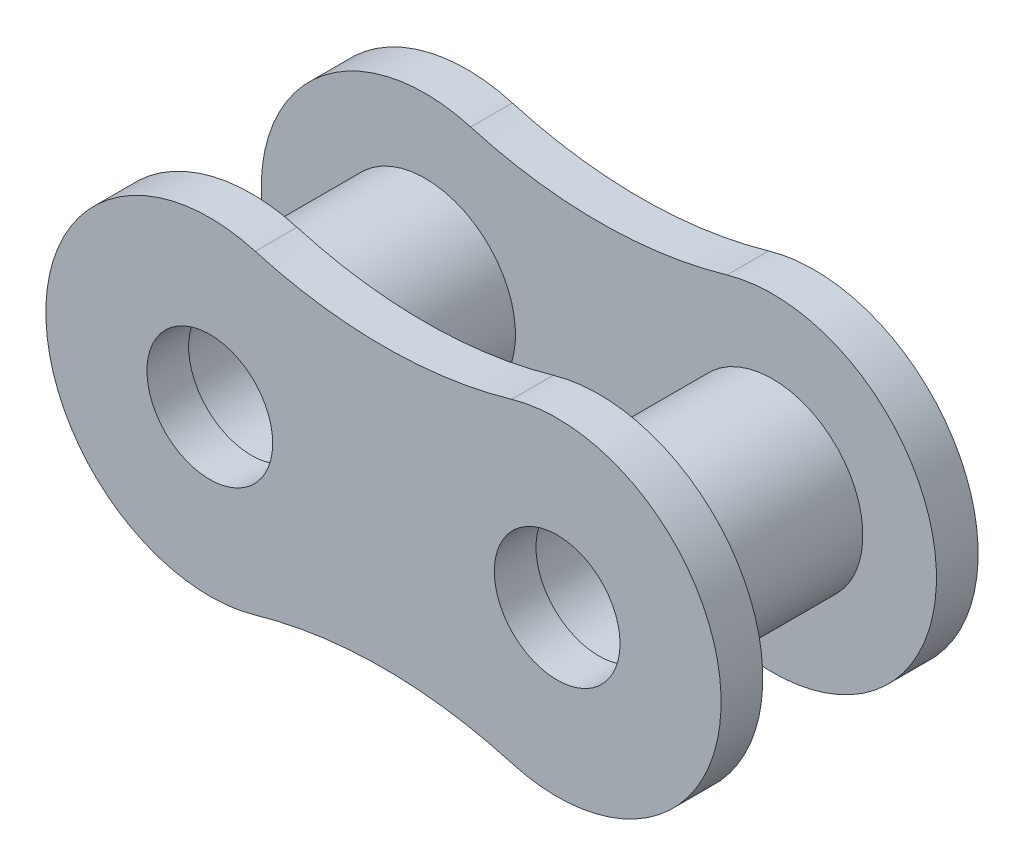
ISO-10303-21;
HEADER;
FILE_DESCRIPTION(('STEP AP214'),'2;1');
FILE_NAME('part.step','',(''),(''),'','','');
FILE_SCHEMA(('AUTOMOTIVE_DESIGN { 1 0 10303 214 1 1 1 1 }'));
ENDSEC;
DATA;
#1=APPLICATION_CONTEXT('core data for automotive mechanical design processes');
#2=APPLICATION_PROTOCOL_DEFINITION('international standard','automotive_design',2000,#1);
#3=PRODUCT_CONTEXT('',#1,'mechanical');
#4=PRODUCT('Part','Part','',(#3));
#5=PRODUCT_RELATED_PRODUCT_CATEGORY('part','',(#4));
#6=PRODUCT_DEFINITION_FORMATION('','',#4);
#7=PRODUCT_DEFINITION_CONTEXT('part definition',#1,'design');
#8=PRODUCT_DEFINITION('design','',#6,#7);
#9=PRODUCT_DEFINITION_SHAPE('','',#8);
#10=(LENGTH_UNIT() NAMED_UNIT(*) SI_UNIT(.MILLI.,.METRE.));
#11=(NAMED_UNIT(*) PLANE_ANGLE_UNIT() SI_UNIT($,.RADIAN.));
#12=(NAMED_UNIT(*) SI_UNIT($,.STERADIAN.) SOLID_ANGLE_UNIT());
#13=UNCERTAINTY_MEASURE_WITH_UNIT(LENGTH_MEASURE(1.E-05),#10,'distance_accuracy_value','');
#14=(GEOMETRIC_REPRESENTATION_CONTEXT(3) GLOBAL_UNCERTAINTY_ASSIGNED_CONTEXT((#13)) GLOBAL_UNIT_ASSIGNED_CONTEXT((#10,
#11,#12)) REPRESENTATION_CONTEXT('',''));
#15=CARTESIAN_POINT('',(0.,0.,0.));
#16=DIRECTION('',(0.,0.,1.));
#17=DIRECTION('',(1.,0.,0.));
#18=AXIS2_PLACEMENT_3D('',#15,#16,#17);
#19=CARTESIAN_POINT('',(1.5875,5.4931840960452,-1.5875));
#20=DIRECTION('',(0.,0.,-1.));
#21=DIRECTION('',(1.,0.,0.));
#22=AXIS2_PLACEMENT_3D('',#19,#20,#21);
#23=PLANE('',#22);
#24=CARTESIAN_POINT('',(0.,10.9863681920904,-1.5875));
#25=DIRECTION('',(0.,0.,-1.));
#26=DIRECTION('',(1.,0.,0.));
#27=AXIS2_PLACEMENT_3D('',#24,#25,#26);
#28=CIRCLE('',#27,8.4387481920904);
#29=CARTESIAN_POINT('',(2.34287748246518,2.87937145151707,-1.5875));
#30=VERTEX_POINT('',#29);
#31=CARTESIAN_POINT('',(-2.34287748246518,2.87937145151707,-1.5875));
#32=VERTEX_POINT('',#31);
#33=EDGE_CURVE('E157',#30,#32,#28,.T.);
#34=ORIENTED_EDGE('',*,*,#33,.T.);
#35=CARTESIAN_POINT('',(-3.175,0.,-1.5875));
#36=DIRECTION('',(0.,0.,1.));
#37=DIRECTION('',(1.,0.,0.));
#38=AXIS2_PLACEMENT_3D('',#35,#36,#37);
#39=CIRCLE('',#38,2.9972);
#40=CARTESIAN_POINT('',(-2.34287748246518,-2.87937145151707,-1.5875));
#41=VERTEX_POINT('',#40);
#42=EDGE_CURVE('E171',#32,#41,#39,.T.);
#43=ORIENTED_EDGE('',*,*,#42,.T.);
#44=CARTESIAN_POINT('',(0.,-10.9863681920904,-1.5875));
#45=DIRECTION('',(0.,0.,-1.));
#46=DIRECTION('',(1.,0.,0.));
#47=AXIS2_PLACEMENT_3D('',#44,#45,#46);
#48=CIRCLE('',#47,8.4387481920904);
#49=CARTESIAN_POINT('',(2.34287748246518,-2.87937145151707,-1.5875));
#50=VERTEX_POINT('',#49);
#51=EDGE_CURVE('E174',#41,#50,#48,.T.);
#52=ORIENTED_EDGE('',*,*,#51,.T.);
#53=CARTESIAN_POINT('',(3.175,0.,-1.5875));
#54=DIRECTION('',(0.,0.,1.));
#55=DIRECTION('',(1.,0.,0.));
#56=AXIS2_PLACEMENT_3D('',#53,#54,#55);
#57=CIRCLE('',#56,2.9972);
#58=EDGE_CURVE('E163',#50,#30,#57,.T.);
#59=ORIENTED_EDGE('',*,*,#58,.T.);
#60=EDGE_LOOP('',(#34,#43,#52,#59));
#61=FACE_BOUND('',#60,.T.);
#62=CARTESIAN_POINT('',(-3.175,0.,-1.5875));
#63=DIRECTION('',(0.,0.,-1.));
#64=DIRECTION('',(-1.,0.,0.));
#65=AXIS2_PLACEMENT_3D('',#62,#63,#64);
#66=CIRCLE('',#65,1.651);
#67=CARTESIAN_POINT('',(-4.826,0.,-1.5875));
#68=VERTEX_POINT('',#67);
#69=EDGE_CURVE('E45',#68,#68,#66,.F.);
#70=ORIENTED_EDGE('',*,*,#69,.F.);
#71=EDGE_LOOP('',(#70));
#72=FACE_BOUND('',#71,.T.);
#73=CARTESIAN_POINT('',(3.175,0.,-1.5875));
#74=DIRECTION('',(0.,0.,-1.));
#75=DIRECTION('',(-1.,0.,0.));
#76=AXIS2_PLACEMENT_3D('',#73,#74,#75);
#77=CIRCLE('',#76,1.651);
#78=CARTESIAN_POINT('',(1.524,0.,-1.5875));
#79=VERTEX_POINT('',#78);
#80=EDGE_CURVE('E11',#79,#79,#77,.F.);
#81=ORIENTED_EDGE('',*,*,#80,.F.);
#82=EDGE_LOOP('',(#81));
#83=FACE_BOUND('',#82,.T.);
#84=ADVANCED_FACE('F36',(#61,#72,#83),#23,.F.);
#85=CARTESIAN_POINT('',(3.175,0.,-1.5875));
#86=DIRECTION('',(0.,0.,1.));
#87=DIRECTION('',(1.,0.,0.));
#88=AXIS2_PLACEMENT_3D('',#85,#86,#87);
#89=CIRCLE('',#88,1.17475);
#90=CARTESIAN_POINT('',(4.34975,0.,-1.5875));
#91=VERTEX_POINT('',#90);
#92=EDGE_CURVE('E275',#91,#91,#89,.T.);
#93=ORIENTED_EDGE('',*,*,#92,.T.);
#94=EDGE_LOOP('',(#93));
#95=FACE_BOUND('',#94,.T.);
#96=CARTESIAN_POINT('',(3.175,0.,-1.5875));
#97=DIRECTION('',(0.,0.,1.));
#98=DIRECTION('',(1.,0.,0.));
#99=AXIS2_PLACEMENT_3D('',#96,#97,#98);
#100=CIRCLE('',#99,1.14935);
#101=CARTESIAN_POINT('',(4.32435,0.,-1.5875));
#102=VERTEX_POINT('',#101);
#103=EDGE_CURVE('E147',#102,#102,#100,.T.);
#104=ORIENTED_EDGE('',*,*,#103,.F.);
#105=EDGE_LOOP('',(#104));
#106=FACE_BOUND('',#105,.T.);
#107=ADVANCED_FACE('F189',(#95,#106),#23,.F.);
#108=CARTESIAN_POINT('',(1.5875,5.4931840960452,-2.3495));
#109=DIRECTION('',(0.,0.,-1.));
#110=DIRECTION('',(1.,0.,0.));
#111=AXIS2_PLACEMENT_3D('',#108,#109,#110);
#112=PLANE('',#111);
#113=CARTESIAN_POINT('',(-3.175,0.,-2.3495));
#114=DIRECTION('',(0.,0.,1.));
#115=DIRECTION('',(1.,0.,0.));
#116=AXIS2_PLACEMENT_3D('',#113,#114,#115);
#117=CIRCLE('',#116,1.14935);
#118=CARTESIAN_POINT('',(-2.02565,0.,-2.3495));
#119=VERTEX_POINT('',#118);
#120=EDGE_CURVE('E154',#119,#119,#117,.T.);
#121=ORIENTED_EDGE('',*,*,#120,.T.);
#122=EDGE_LOOP('',(#121));
#123=FACE_BOUND('',#122,.T.);
#124=CARTESIAN_POINT('',(0.,10.9863681920904,-2.3495));
#125=DIRECTION('',(0.,0.,-1.));
#126=DIRECTION('',(1.,0.,0.));
#127=AXIS2_PLACEMENT_3D('',#124,#125,#126);
#128=CIRCLE('',#127,8.4387481920904);
#129=CARTESIAN_POINT('',(2.34287748246518,2.87937145151707,-2.3495));
#130=VERTEX_POINT('',#129);
#131=CARTESIAN_POINT('',(-2.34287748246518,2.87937145151707,-2.3495));
#132=VERTEX_POINT('',#131);
#133=EDGE_CURVE('E160',#130,#132,#128,.T.);
#134=ORIENTED_EDGE('',*,*,#133,.F.);
#135=CARTESIAN_POINT('',(3.175,0.,-2.3495));
#136=DIRECTION('',(0.,0.,1.));
#137=DIRECTION('',(1.,0.,0.));
#138=AXIS2_PLACEMENT_3D('',#135,#136,#137);
#139=CIRCLE('',#138,2.9972);
#140=CARTESIAN_POINT('',(2.34287748246518,-2.87937145151707,-2.3495));
#141=VERTEX_POINT('',#140);
#142=EDGE_CURVE('E167',#141,#130,#139,.T.);
#143=ORIENTED_EDGE('',*,*,#142,.F.);
#144=CARTESIAN_POINT('',(0.,-10.9863681920904,-2.3495));
#145=DIRECTION('',(0.,0.,-1.));
#146=DIRECTION('',(1.,0.,0.));
#147=AXIS2_PLACEMENT_3D('',#144,#145,#146);
#148=CIRCLE('',#147,8.4387481920904);
#149=CARTESIAN_POINT('',(-2.34287748246518,-2.87937145151707,-2.3495));
#150=VERTEX_POINT('',#149);
#151=EDGE_CURVE('E165',#150,#141,#148,.T.);
#152=ORIENTED_EDGE('',*,*,#151,.F.);
#153=CARTESIAN_POINT('',(-3.175,0.,-2.3495));
#154=DIRECTION('',(0.,0.,1.));
#155=DIRECTION('',(1.,0.,0.));
#156=AXIS2_PLACEMENT_3D('',#153,#154,#155);
#157=CIRCLE('',#156,2.9972);
#158=EDGE_CURVE('E162',#132,#150,#157,.T.);
#159=ORIENTED_EDGE('',*,*,#158,.F.);
#160=EDGE_LOOP('',(#134,#143,#152,#159));
#161=FACE_BOUND('',#160,.T.);
#162=CARTESIAN_POINT('',(3.175,0.,-2.3495));
#163=DIRECTION('',(0.,0.,1.));
#164=DIRECTION('',(1.,0.,0.));
#165=AXIS2_PLACEMENT_3D('',#162,#163,#164);
#166=CIRCLE('',#165,1.14935);
#167=CARTESIAN_POINT('',(4.32435,0.,-2.3495));
#168=VERTEX_POINT('',#167);
#169=EDGE_CURVE('E148',#168,#168,#166,.T.);
#170=ORIENTED_EDGE('',*,*,#169,.T.);
#171=EDGE_LOOP('',(#170));
#172=FACE_BOUND('',#171,.T.);
#173=ADVANCED_FACE('F245',(#123,#161,#172),#112,.T.);
#174=CARTESIAN_POINT('',(-3.175,0.,-1.5875));
#175=DIRECTION('',(0.,0.,1.));
#176=DIRECTION('',(1.,0.,0.));
#177=AXIS2_PLACEMENT_3D('',#174,#175,#176);
#178=CIRCLE('',#177,1.17475);
#179=CARTESIAN_POINT('',(-2.00025,0.,-1.5875));
#180=VERTEX_POINT('',#179);
#181=EDGE_CURVE('E284',#180,#180,#178,.T.);
#182=ORIENTED_EDGE('',*,*,#181,.T.);
#183=EDGE_LOOP('',(#182));
#184=FACE_BOUND('',#183,.T.);
#185=CARTESIAN_POINT('',(-3.175,0.,-1.5875));
#186=DIRECTION('',(0.,0.,1.));
#187=DIRECTION('',(1.,0.,0.));
#188=AXIS2_PLACEMENT_3D('',#185,#186,#187);
#189=CIRCLE('',#188,1.14935);
#190=CARTESIAN_POINT('',(-2.02565,0.,-1.5875));
#191=VERTEX_POINT('',#190);
#192=EDGE_CURVE('E151',#191,#191,#189,.T.);
#193=ORIENTED_EDGE('',*,*,#192,.F.);
#194=EDGE_LOOP('',(#193));
#195=FACE_BOUND('',#194,.T.);
#196=ADVANCED_FACE('F192',(#184,#195),#23,.F.);
#197=CARTESIAN_POINT('',(0.,10.9863681920904,-2.3495));
#198=DIRECTION('',(0.,0.,1.));
#199=DIRECTION('',(-1.,0.,0.));
#200=AXIS2_PLACEMENT_3D('',#197,#198,#199);
#201=CYLINDRICAL_SURFACE('',#200,8.4387481920904);
#202=ORIENTED_EDGE('',*,*,#33,.F.);
#203=DIRECTION('',(0.,0.,1.));
#204=VECTOR('',#203,1.);
#205=CARTESIAN_POINT('',(2.34287748246518,2.87937145151707,-2.3495));
#206=LINE('',#205,#204);
#207=EDGE_CURVE('E53',#130,#30,#206,.T.);
#208=ORIENTED_EDGE('',*,*,#207,.F.);
#209=ORIENTED_EDGE('',*,*,#133,.T.);
#210=DIRECTION('',(0.,0.,1.));
#211=VECTOR('',#210,1.);
#212=CARTESIAN_POINT('',(-2.34287748246518,2.87937145151707,-2.3495));
#213=LINE('',#212,#211);
#214=EDGE_CURVE('E81',#132,#32,#213,.T.);
#215=ORIENTED_EDGE('',*,*,#214,.T.);
#216=EDGE_LOOP('',(#202,#208,#209,#215));
#217=FACE_BOUND('',#216,.T.);
#218=ADVANCED_FACE('F38',(#217),#201,.F.);
#219=CARTESIAN_POINT('',(-3.175,0.,-2.3495));
#220=DIRECTION('',(0.,0.,1.));
#221=DIRECTION('',(-1.,0.,0.));
#222=AXIS2_PLACEMENT_3D('',#219,#220,#221);
#223=CYLINDRICAL_SURFACE('',#222,2.9972);
#224=ORIENTED_EDGE('',*,*,#42,.F.);
#225=ORIENTED_EDGE('',*,*,#214,.F.);
#226=ORIENTED_EDGE('',*,*,#158,.T.);
#227=DIRECTION('',(0.,0.,1.));
#228=VECTOR('',#227,1.);
#229=CARTESIAN_POINT('',(-2.34287748246518,-2.87937145151707,-2.3495));
#230=LINE('',#229,#228);
#231=EDGE_CURVE('E180',#150,#41,#230,.T.);
#232=ORIENTED_EDGE('',*,*,#231,.T.);
#233=EDGE_LOOP('',(#224,#225,#226,#232));
#234=FACE_BOUND('',#233,.T.);
#235=ADVANCED_FACE('F255',(#234),#223,.T.);
#236=CARTESIAN_POINT('',(0.,-10.9863681920904,-2.3495));
#237=DIRECTION('',(0.,0.,1.));
#238=DIRECTION('',(-1.,0.,0.));
#239=AXIS2_PLACEMENT_3D('',#236,#237,#238);
#240=CYLINDRICAL_SURFACE('',#239,8.4387481920904);
#241=ORIENTED_EDGE('',*,*,#51,.F.);
#242=ORIENTED_EDGE('',*,*,#231,.F.);
#243=ORIENTED_EDGE('',*,*,#151,.T.);
#244=DIRECTION('',(0.,0.,1.));
#245=VECTOR('',#244,1.);
#246=CARTESIAN_POINT('',(2.34287748246518,-2.87937145151707,-2.3495));
#247=LINE('',#246,#245);
#248=EDGE_CURVE('E71',#141,#50,#247,.T.);
#249=ORIENTED_EDGE('',*,*,#248,.T.);
#250=EDGE_LOOP('',(#241,#242,#243,#249));
#251=FACE_BOUND('',#250,.T.);
#252=ADVANCED_FACE('F253',(#251),#240,.F.);
#253=CARTESIAN_POINT('',(3.175,0.,-2.3495));
#254=DIRECTION('',(0.,0.,1.));
#255=DIRECTION('',(-1.,0.,0.));
#256=AXIS2_PLACEMENT_3D('',#253,#254,#255);
#257=CYLINDRICAL_SURFACE('',#256,2.9972);
#258=ORIENTED_EDGE('',*,*,#58,.F.);
#259=ORIENTED_EDGE('',*,*,#248,.F.);
#260=ORIENTED_EDGE('',*,*,#142,.T.);
#261=ORIENTED_EDGE('',*,*,#207,.T.);
#262=EDGE_LOOP('',(#258,#259,#260,#261));
#263=FACE_BOUND('',#262,.T.);
#264=ADVANCED_FACE('F243',(#263),#257,.T.);
#265=CARTESIAN_POINT('',(-3.175,0.,-2.3495));
#266=DIRECTION('',(0.,0.,1.));
#267=DIRECTION('',(-1.,0.,0.));
#268=AXIS2_PLACEMENT_3D('',#265,#266,#267);
#269=CYLINDRICAL_SURFACE('',#268,1.14935);
#270=ORIENTED_EDGE('',*,*,#120,.F.);
#271=EDGE_LOOP('',(#270));
#272=FACE_BOUND('',#271,.T.);
#273=ORIENTED_EDGE('',*,*,#192,.T.);
#274=EDGE_LOOP('',(#273));
#275=FACE_BOUND('',#274,.T.);
#276=ADVANCED_FACE('F239',(#272,#275),#269,.F.);
#277=CARTESIAN_POINT('',(3.175,0.,-2.3495));
#278=DIRECTION('',(0.,0.,1.));
#279=DIRECTION('',(-1.,0.,0.));
#280=AXIS2_PLACEMENT_3D('',#277,#278,#279);
#281=CYLINDRICAL_SURFACE('',#280,1.14935);
#282=ORIENTED_EDGE('',*,*,#169,.F.);
#283=EDGE_LOOP('',(#282));
#284=FACE_BOUND('',#283,.T.);
#285=ORIENTED_EDGE('',*,*,#103,.T.);
#286=EDGE_LOOP('',(#285));
#287=FACE_BOUND('',#286,.T.);
#288=ADVANCED_FACE('F236',(#284,#287),#281,.F.);
#289=CARTESIAN_POINT('',(1.5875,5.4931840960452,1.5875));
#290=DIRECTION('',(0.,0.,1.));
#291=DIRECTION('',(1.,0.,0.));
#292=AXIS2_PLACEMENT_3D('',#289,#290,#291);
#293=PLANE('',#292);
#294=CARTESIAN_POINT('',(0.,10.9863681920904,1.5875));
#295=DIRECTION('',(0.,0.,-1.));
#296=DIRECTION('',(1.,0.,0.));
#297=AXIS2_PLACEMENT_3D('',#294,#295,#296);
#298=CIRCLE('',#297,8.4387481920904);
#299=CARTESIAN_POINT('',(2.34287748246518,2.87937145151707,1.5875));
#300=VERTEX_POINT('',#299);
#301=CARTESIAN_POINT('',(-2.34287748246518,2.87937145151707,1.5875));
#302=VERTEX_POINT('',#301);
#303=EDGE_CURVE('E135',#300,#302,#298,.T.);
#304=ORIENTED_EDGE('',*,*,#303,.F.);
#305=CARTESIAN_POINT('',(3.175,0.,1.5875));
#306=DIRECTION('',(0.,0.,1.));
#307=DIRECTION('',(1.,0.,0.));
#308=AXIS2_PLACEMENT_3D('',#305,#306,#307);
#309=CIRCLE('',#308,2.9972);
#310=CARTESIAN_POINT('',(2.34287748246518,-2.87937145151707,1.5875));
#311=VERTEX_POINT('',#310);
#312=EDGE_CURVE('E131',#311,#300,#309,.T.);
#313=ORIENTED_EDGE('',*,*,#312,.F.);
#314=CARTESIAN_POINT('',(0.,-10.9863681920904,1.5875));
#315=DIRECTION('',(0.,0.,-1.));
#316=DIRECTION('',(1.,0.,0.));
#317=AXIS2_PLACEMENT_3D('',#314,#315,#316);
#318=CIRCLE('',#317,8.4387481920904);
#319=CARTESIAN_POINT('',(-2.34287748246518,-2.87937145151707,1.5875));
#320=VERTEX_POINT('',#319);
#321=EDGE_CURVE('E305',#320,#311,#318,.T.);
#322=ORIENTED_EDGE('',*,*,#321,.F.);
#323=CARTESIAN_POINT('',(-3.175,0.,1.5875));
#324=DIRECTION('',(0.,0.,1.));
#325=DIRECTION('',(1.,0.,0.));
#326=AXIS2_PLACEMENT_3D('',#323,#324,#325);
#327=CIRCLE('',#326,2.9972);
#328=EDGE_CURVE('E303',#302,#320,#327,.T.);
#329=ORIENTED_EDGE('',*,*,#328,.F.);
#330=EDGE_LOOP('',(#304,#313,#322,#329));
#331=FACE_BOUND('',#330,.T.);
#332=CARTESIAN_POINT('',(3.175,0.,1.5875));
#333=DIRECTION('',(0.,0.,1.));
#334=DIRECTION('',(1.,0.,0.));
#335=AXIS2_PLACEMENT_3D('',#332,#333,#334);
#336=CIRCLE('',#335,1.651);
#337=CARTESIAN_POINT('',(4.826,0.,1.5875));
#338=VERTEX_POINT('',#337);
#339=EDGE_CURVE('E136',#338,#338,#336,.F.);
#340=ORIENTED_EDGE('',*,*,#339,.F.);
#341=EDGE_LOOP('',(#340));
#342=FACE_BOUND('',#341,.T.);
#343=CARTESIAN_POINT('',(-3.175,0.,1.5875));
#344=DIRECTION('',(0.,0.,1.));
#345=DIRECTION('',(1.,0.,0.));
#346=AXIS2_PLACEMENT_3D('',#343,#344,#345);
#347=CIRCLE('',#346,1.651);
#348=CARTESIAN_POINT('',(-1.524,0.,1.5875));
#349=VERTEX_POINT('',#348);
#350=EDGE_CURVE('E139',#349,#349,#347,.F.);
#351=ORIENTED_EDGE('',*,*,#350,.F.);
#352=EDGE_LOOP('',(#351));
#353=FACE_BOUND('',#352,.T.);
#354=ADVANCED_FACE('F224',(#331,#342,#353),#293,.F.);
#355=CARTESIAN_POINT('',(-3.175,0.,1.5875));
#356=DIRECTION('',(0.,0.,1.));
#357=DIRECTION('',(1.,0.,0.));
#358=AXIS2_PLACEMENT_3D('',#355,#356,#357);
#359=CIRCLE('',#358,1.17475);
#360=CARTESIAN_POINT('',(-2.00025,0.,1.5875));
#361=VERTEX_POINT('',#360);
#362=EDGE_CURVE('E278',#361,#361,#359,.T.);
#363=ORIENTED_EDGE('',*,*,#362,.F.);
#364=EDGE_LOOP('',(#363));
#365=FACE_BOUND('',#364,.T.);
#366=CARTESIAN_POINT('',(-3.175,0.,1.5875));
#367=DIRECTION('',(0.,0.,1.));
#368=DIRECTION('',(1.,0.,0.));
#369=AXIS2_PLACEMENT_3D('',#366,#367,#368);
#370=CIRCLE('',#369,1.14935);
#371=CARTESIAN_POINT('',(-2.02565,0.,1.5875));
#372=VERTEX_POINT('',#371);
#373=EDGE_CURVE('E291',#372,#372,#370,.T.);
#374=ORIENTED_EDGE('',*,*,#373,.T.);
#375=EDGE_LOOP('',(#374));
#376=FACE_BOUND('',#375,.T.);
#377=ADVANCED_FACE('F219',(#365,#376),#293,.F.);
#378=CARTESIAN_POINT('',(1.5875,5.4931840960452,2.3495));
#379=DIRECTION('',(0.,0.,1.));
#380=DIRECTION('',(1.,0.,0.));
#381=AXIS2_PLACEMENT_3D('',#378,#379,#380);
#382=PLANE('',#381);
#383=CARTESIAN_POINT('',(-3.175,0.,2.3495));
#384=DIRECTION('',(0.,0.,1.));
#385=DIRECTION('',(1.,0.,0.));
#386=AXIS2_PLACEMENT_3D('',#383,#384,#385);
#387=CIRCLE('',#386,1.14935);
#388=CARTESIAN_POINT('',(-2.02565,0.,2.3495));
#389=VERTEX_POINT('',#388);
#390=EDGE_CURVE('E294',#389,#389,#387,.T.);
#391=ORIENTED_EDGE('',*,*,#390,.F.);
#392=EDGE_LOOP('',(#391));
#393=FACE_BOUND('',#392,.T.);
#394=CARTESIAN_POINT('',(0.,10.9863681920904,2.3495));
#395=DIRECTION('',(0.,0.,-1.));
#396=DIRECTION('',(1.,0.,0.));
#397=AXIS2_PLACEMENT_3D('',#394,#395,#396);
#398=CIRCLE('',#397,8.4387481920904);
#399=CARTESIAN_POINT('',(2.34287748246518,2.87937145151707,2.3495));
#400=VERTEX_POINT('',#399);
#401=CARTESIAN_POINT('',(-2.34287748246518,2.87937145151707,2.3495));
#402=VERTEX_POINT('',#401);
#403=EDGE_CURVE('E121',#400,#402,#398,.T.);
#404=ORIENTED_EDGE('',*,*,#403,.T.);
#405=CARTESIAN_POINT('',(-3.175,0.,2.3495));
#406=DIRECTION('',(0.,0.,1.));
#407=DIRECTION('',(1.,0.,0.));
#408=AXIS2_PLACEMENT_3D('',#405,#406,#407);
#409=CIRCLE('',#408,2.9972);
#410=CARTESIAN_POINT('',(-2.34287748246518,-2.87937145151707,2.3495));
#411=VERTEX_POINT('',#410);
#412=EDGE_CURVE('E110',#402,#411,#409,.T.);
#413=ORIENTED_EDGE('',*,*,#412,.T.);
#414=CARTESIAN_POINT('',(0.,-10.9863681920904,2.3495));
#415=DIRECTION('',(0.,0.,-1.));
#416=DIRECTION('',(1.,0.,0.));
#417=AXIS2_PLACEMENT_3D('',#414,#415,#416);
#418=CIRCLE('',#417,8.4387481920904);
#419=CARTESIAN_POINT('',(2.34287748246518,-2.87937145151707,2.3495));
#420=VERTEX_POINT('',#419);
#421=EDGE_CURVE('E120',#411,#420,#418,.T.);
#422=ORIENTED_EDGE('',*,*,#421,.T.);
#423=CARTESIAN_POINT('',(3.175,0.,2.3495));
#424=DIRECTION('',(0.,0.,1.));
#425=DIRECTION('',(1.,0.,0.));
#426=AXIS2_PLACEMENT_3D('',#423,#424,#425);
#427=CIRCLE('',#426,2.9972);
#428=EDGE_CURVE('E127',#420,#400,#427,.T.);
#429=ORIENTED_EDGE('',*,*,#428,.T.);
#430=EDGE_LOOP('',(#404,#413,#422,#429));
#431=FACE_BOUND('',#430,.T.);
#432=CARTESIAN_POINT('',(3.175,0.,2.3495));
#433=DIRECTION('',(0.,0.,1.));
#434=DIRECTION('',(1.,0.,0.));
#435=AXIS2_PLACEMENT_3D('',#432,#433,#434);
#436=CIRCLE('',#435,1.14935);
#437=CARTESIAN_POINT('',(4.32435,0.,2.3495));
#438=VERTEX_POINT('',#437);
#439=EDGE_CURVE('E288',#438,#438,#436,.T.);
#440=ORIENTED_EDGE('',*,*,#439,.F.);
#441=EDGE_LOOP('',(#440));
#442=FACE_BOUND('',#441,.T.);
#443=ADVANCED_FACE('F124',(#393,#431,#442),#382,.T.);
#444=CARTESIAN_POINT('',(3.175,0.,1.5875));
#445=DIRECTION('',(0.,0.,1.));
#446=DIRECTION('',(1.,0.,0.));
#447=AXIS2_PLACEMENT_3D('',#444,#445,#446);
#448=CIRCLE('',#447,1.17475);
#449=CARTESIAN_POINT('',(4.34975,0.,1.5875));
#450=VERTEX_POINT('',#449);
#451=EDGE_CURVE('E277',#450,#450,#448,.T.);
#452=ORIENTED_EDGE('',*,*,#451,.F.);
#453=EDGE_LOOP('',(#452));
#454=FACE_BOUND('',#453,.T.);
#455=CARTESIAN_POINT('',(3.175,0.,1.5875));
#456=DIRECTION('',(0.,0.,1.));
#457=DIRECTION('',(1.,0.,0.));
#458=AXIS2_PLACEMENT_3D('',#455,#456,#457);
#459=CIRCLE('',#458,1.14935);
#460=CARTESIAN_POINT('',(4.32435,0.,1.5875));
#461=VERTEX_POINT('',#460);
#462=EDGE_CURVE('E281',#461,#461,#459,.T.);
#463=ORIENTED_EDGE('',*,*,#462,.T.);
#464=EDGE_LOOP('',(#463));
#465=FACE_BOUND('',#464,.T.);
#466=ADVANCED_FACE('F218',(#454,#465),#293,.F.);
#467=CARTESIAN_POINT('',(0.,10.9863681920904,2.3495));
#468=DIRECTION('',(0.,0.,-1.));
#469=DIRECTION('',(-1.,0.,0.));
#470=AXIS2_PLACEMENT_3D('',#467,#468,#469);
#471=CYLINDRICAL_SURFACE('',#470,8.4387481920904);
#472=ORIENTED_EDGE('',*,*,#303,.T.);
#473=DIRECTION('',(0.,0.,-1.));
#474=VECTOR('',#473,1.);
#475=CARTESIAN_POINT('',(-2.34287748246518,2.87937145151707,2.3495));
#476=LINE('',#475,#474);
#477=EDGE_CURVE('E114',#402,#302,#476,.T.);
#478=ORIENTED_EDGE('',*,*,#477,.F.);
#479=ORIENTED_EDGE('',*,*,#403,.F.);
#480=DIRECTION('',(0.,0.,-1.));
#481=VECTOR('',#480,1.);
#482=CARTESIAN_POINT('',(2.34287748246518,2.87937145151707,2.3495));
#483=LINE('',#482,#481);
#484=EDGE_CURVE('E301',#400,#300,#483,.T.);
#485=ORIENTED_EDGE('',*,*,#484,.T.);
#486=EDGE_LOOP('',(#472,#478,#479,#485));
#487=FACE_BOUND('',#486,.T.);
#488=ADVANCED_FACE('F133',(#487),#471,.F.);
#489=CARTESIAN_POINT('',(-3.175,0.,2.3495));
#490=DIRECTION('',(0.,0.,-1.));
#491=DIRECTION('',(-1.,0.,0.));
#492=AXIS2_PLACEMENT_3D('',#489,#490,#491);
#493=CYLINDRICAL_SURFACE('',#492,2.9972);
#494=ORIENTED_EDGE('',*,*,#328,.T.);
#495=DIRECTION('',(0.,0.,-1.));
#496=VECTOR('',#495,1.);
#497=CARTESIAN_POINT('',(-2.34287748246518,-2.87937145151707,2.3495));
#498=LINE('',#497,#496);
#499=EDGE_CURVE('E117',#411,#320,#498,.T.);
#500=ORIENTED_EDGE('',*,*,#499,.F.);
#501=ORIENTED_EDGE('',*,*,#412,.F.);
#502=ORIENTED_EDGE('',*,*,#477,.T.);
#503=EDGE_LOOP('',(#494,#500,#501,#502));
#504=FACE_BOUND('',#503,.T.);
#505=ADVANCED_FACE('F112',(#504),#493,.T.);
#506=CARTESIAN_POINT('',(0.,-10.9863681920904,2.3495));
#507=DIRECTION('',(0.,0.,-1.));
#508=DIRECTION('',(-1.,0.,0.));
#509=AXIS2_PLACEMENT_3D('',#506,#507,#508);
#510=CYLINDRICAL_SURFACE('',#509,8.4387481920904);
#511=ORIENTED_EDGE('',*,*,#321,.T.);
#512=DIRECTION('',(0.,0.,-1.));
#513=VECTOR('',#512,1.);
#514=CARTESIAN_POINT('',(2.34287748246518,-2.87937145151707,2.3495));
#515=LINE('',#514,#513);
#516=EDGE_CURVE('E141',#420,#311,#515,.T.);
#517=ORIENTED_EDGE('',*,*,#516,.F.);
#518=ORIENTED_EDGE('',*,*,#421,.F.);
#519=ORIENTED_EDGE('',*,*,#499,.T.);
#520=EDGE_LOOP('',(#511,#517,#518,#519));
#521=FACE_BOUND('',#520,.T.);
#522=ADVANCED_FACE('F227',(#521),#510,.F.);
#523=CARTESIAN_POINT('',(3.175,0.,2.3495));
#524=DIRECTION('',(0.,0.,-1.));
#525=DIRECTION('',(-1.,0.,0.));
#526=AXIS2_PLACEMENT_3D('',#523,#524,#525);
#527=CYLINDRICAL_SURFACE('',#526,2.9972);
#528=ORIENTED_EDGE('',*,*,#312,.T.);
#529=ORIENTED_EDGE('',*,*,#484,.F.);
#530=ORIENTED_EDGE('',*,*,#428,.F.);
#531=ORIENTED_EDGE('',*,*,#516,.T.);
#532=EDGE_LOOP('',(#528,#529,#530,#531));
#533=FACE_BOUND('',#532,.T.);
#534=ADVANCED_FACE('F214',(#533),#527,.T.);
#535=CARTESIAN_POINT('',(-3.175,0.,2.3495));
#536=DIRECTION('',(0.,0.,-1.));
#537=DIRECTION('',(-1.,0.,0.));
#538=AXIS2_PLACEMENT_3D('',#535,#536,#537);
#539=CYLINDRICAL_SURFACE('',#538,1.14935);
#540=ORIENTED_EDGE('',*,*,#390,.T.);
#541=EDGE_LOOP('',(#540));
#542=FACE_BOUND('',#541,.T.);
#543=ORIENTED_EDGE('',*,*,#373,.F.);
#544=EDGE_LOOP('',(#543));
#545=FACE_BOUND('',#544,.T.);
#546=ADVANCED_FACE('F207',(#542,#545),#539,.F.);
#547=CARTESIAN_POINT('',(3.175,0.,2.3495));
#548=DIRECTION('',(0.,0.,-1.));
#549=DIRECTION('',(-1.,0.,0.));
#550=AXIS2_PLACEMENT_3D('',#547,#548,#549);
#551=CYLINDRICAL_SURFACE('',#550,1.14935);
#552=ORIENTED_EDGE('',*,*,#439,.T.);
#553=EDGE_LOOP('',(#552));
#554=FACE_BOUND('',#553,.T.);
#555=ORIENTED_EDGE('',*,*,#462,.F.);
#556=EDGE_LOOP('',(#555));
#557=FACE_BOUND('',#556,.T.);
#558=ADVANCED_FACE('F198',(#554,#557),#551,.F.);
#559=CARTESIAN_POINT('',(3.175,0.,1.5875));
#560=DIRECTION('',(0.,0.,-1.));
#561=DIRECTION('',(-1.,0.,0.));
#562=AXIS2_PLACEMENT_3D('',#559,#560,#561);
#563=CYLINDRICAL_SURFACE('',#562,1.651);
#564=ORIENTED_EDGE('',*,*,#339,.T.);
#565=EDGE_LOOP('',(#564));
#566=FACE_BOUND('',#565,.T.);
#567=ORIENTED_EDGE('',*,*,#80,.T.);
#568=EDGE_LOOP('',(#567));
#569=FACE_BOUND('',#568,.T.);
#570=ADVANCED_FACE('F195',(#566,#569),#563,.T.);
#571=CARTESIAN_POINT('',(3.175,0.,1.5875));
#572=DIRECTION('',(0.,0.,-1.));
#573=DIRECTION('',(-1.,0.,0.));
#574=AXIS2_PLACEMENT_3D('',#571,#572,#573);
#575=CYLINDRICAL_SURFACE('',#574,1.17475);
#576=ORIENTED_EDGE('',*,*,#451,.T.);
#577=EDGE_LOOP('',(#576));
#578=FACE_BOUND('',#577,.T.);
#579=ORIENTED_EDGE('',*,*,#92,.F.);
#580=EDGE_LOOP('',(#579));
#581=FACE_BOUND('',#580,.T.);
#582=ADVANCED_FACE('F197',(#578,#581),#575,.F.);
#583=CARTESIAN_POINT('',(-3.175,0.,1.5875));
#584=DIRECTION('',(0.,0.,-1.));
#585=DIRECTION('',(-1.,0.,0.));
#586=AXIS2_PLACEMENT_3D('',#583,#584,#585);
#587=CYLINDRICAL_SURFACE('',#586,1.651);
#588=ORIENTED_EDGE('',*,*,#350,.T.);
#589=EDGE_LOOP('',(#588));
#590=FACE_BOUND('',#589,.T.);
#591=ORIENTED_EDGE('',*,*,#69,.T.);
#592=EDGE_LOOP('',(#591));
#593=FACE_BOUND('',#592,.T.);
#594=ADVANCED_FACE('F185',(#590,#593),#587,.T.);
#595=CARTESIAN_POINT('',(-3.175,0.,1.5875));
#596=DIRECTION('',(0.,0.,-1.));
#597=DIRECTION('',(-1.,0.,0.));
#598=AXIS2_PLACEMENT_3D('',#595,#596,#597);
#599=CYLINDRICAL_SURFACE('',#598,1.17475);
#600=ORIENTED_EDGE('',*,*,#362,.T.);
#601=EDGE_LOOP('',(#600));
#602=FACE_BOUND('',#601,.T.);
#603=ORIENTED_EDGE('',*,*,#181,.F.);
#604=EDGE_LOOP('',(#603));
#605=FACE_BOUND('',#604,.T.);
#606=ADVANCED_FACE('F320',(#602,#605),#599,.F.);
#607=CLOSED_SHELL('',(#84,#107,#173,#196,#218,#235,#252,#264,#276,#288,#354,#377,#443,#466,#488,
#505,#522,#534,#546,#558,#570,#582,#594,#606));
#608=MANIFOLD_SOLID_BREP('B2',#607);
#609=ADVANCED_BREP_SHAPE_REPRESENTATION('',(#18,#608),#14);
#610=SHAPE_DEFINITION_REPRESENTATION(#9,#609);
ENDSEC;
END-ISO-10303-21;
